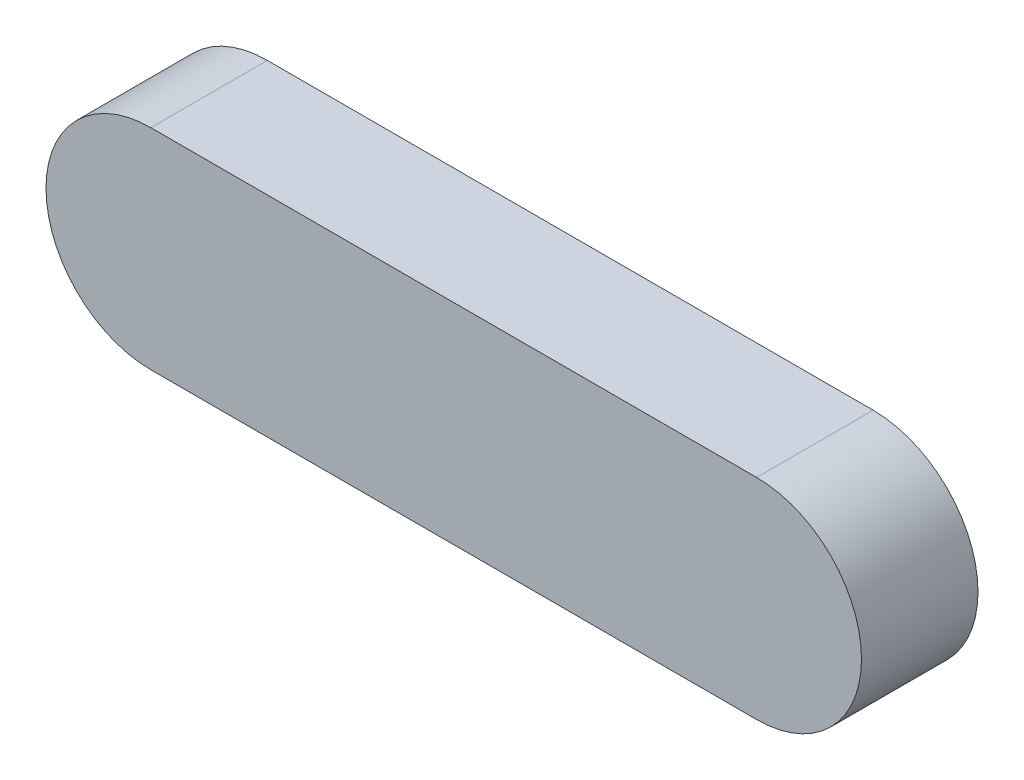
ISO-10303-21;
HEADER;
FILE_DESCRIPTION(('STEP AP214'),'2;1');
FILE_NAME('part.step','',(''),(''),'','','');
FILE_SCHEMA(('AUTOMOTIVE_DESIGN { 1 0 10303 214 1 1 1 1 }'));
ENDSEC;
DATA;
#1=APPLICATION_CONTEXT('core data for automotive mechanical design processes');
#2=APPLICATION_PROTOCOL_DEFINITION('international standard','automotive_design',2000,#1);
#3=PRODUCT_CONTEXT('',#1,'mechanical');
#4=PRODUCT('Part','Part','',(#3));
#5=PRODUCT_RELATED_PRODUCT_CATEGORY('part','',(#4));
#6=PRODUCT_DEFINITION_FORMATION('','',#4);
#7=PRODUCT_DEFINITION_CONTEXT('part definition',#1,'design');
#8=PRODUCT_DEFINITION('design','',#6,#7);
#9=PRODUCT_DEFINITION_SHAPE('','',#8);
#10=(LENGTH_UNIT() NAMED_UNIT(*) SI_UNIT(.MILLI.,.METRE.));
#11=(NAMED_UNIT(*) PLANE_ANGLE_UNIT() SI_UNIT($,.RADIAN.));
#12=(NAMED_UNIT(*) SI_UNIT($,.STERADIAN.) SOLID_ANGLE_UNIT());
#13=UNCERTAINTY_MEASURE_WITH_UNIT(LENGTH_MEASURE(1.E-05),#10,'distance_accuracy_value','');
#14=(GEOMETRIC_REPRESENTATION_CONTEXT(3) GLOBAL_UNCERTAINTY_ASSIGNED_CONTEXT((#13)) GLOBAL_UNIT_ASSIGNED_CONTEXT((#10,
#11,#12)) REPRESENTATION_CONTEXT('',''));
#15=CARTESIAN_POINT('',(0.,0.,0.));
#16=DIRECTION('',(0.,0.,1.));
#17=DIRECTION('',(1.,0.,0.));
#18=AXIS2_PLACEMENT_3D('',#15,#16,#17);
#19=CARTESIAN_POINT('',(-52.,0.,20.));
#20=DIRECTION('',(0.,0.,-1.));
#21=DIRECTION('',(-1.,0.,0.));
#22=AXIS2_PLACEMENT_3D('',#19,#20,#21);
#23=CYLINDRICAL_SURFACE('',#22,18.);
#24=CARTESIAN_POINT('',(-52.,0.,0.));
#25=DIRECTION('',(0.,0.,1.));
#26=DIRECTION('',(1.,0.,0.));
#27=AXIS2_PLACEMENT_3D('',#24,#25,#26);
#28=CIRCLE('',#27,18.);
#29=CARTESIAN_POINT('',(-52.,18.,0.));
#30=VERTEX_POINT('',#29);
#31=CARTESIAN_POINT('',(-52.,-18.,0.));
#32=VERTEX_POINT('',#31);
#33=EDGE_CURVE('E80',#30,#32,#28,.T.);
#34=ORIENTED_EDGE('',*,*,#33,.T.);
#35=DIRECTION('',(0.,0.,-1.));
#36=VECTOR('',#35,1.);
#37=CARTESIAN_POINT('',(-52.,-18.,20.));
#38=LINE('',#37,#36);
#39=CARTESIAN_POINT('',(-52.,-18.,20.));
#40=VERTEX_POINT('',#39);
#41=EDGE_CURVE('E11',#40,#32,#38,.T.);
#42=ORIENTED_EDGE('',*,*,#41,.F.);
#43=CARTESIAN_POINT('',(-52.,0.,20.));
#44=DIRECTION('',(0.,0.,1.));
#45=DIRECTION('',(1.,0.,0.));
#46=AXIS2_PLACEMENT_3D('',#43,#44,#45);
#47=CIRCLE('',#46,18.);
#48=CARTESIAN_POINT('',(-52.,18.,20.));
#49=VERTEX_POINT('',#48);
#50=EDGE_CURVE('E98',#49,#40,#47,.T.);
#51=ORIENTED_EDGE('',*,*,#50,.F.);
#52=DIRECTION('',(0.,0.,-1.));
#53=VECTOR('',#52,1.);
#54=CARTESIAN_POINT('',(-52.,18.,20.));
#55=LINE('',#54,#53);
#56=EDGE_CURVE('E92',#49,#30,#55,.T.);
#57=ORIENTED_EDGE('',*,*,#56,.T.);
#58=EDGE_LOOP('',(#34,#42,#51,#57));
#59=FACE_BOUND('',#58,.T.);
#60=ADVANCED_FACE('F36',(#59),#23,.T.);
#61=CARTESIAN_POINT('',(-52.,-18.,20.));
#62=DIRECTION('',(0.,1.,0.));
#63=DIRECTION('',(-1.,0.,0.));
#64=AXIS2_PLACEMENT_3D('',#61,#62,#63);
#65=PLANE('',#64);
#66=DIRECTION('',(1.,0.,0.));
#67=VECTOR('',#66,1.);
#68=CARTESIAN_POINT('',(-52.,-18.,0.));
#69=LINE('',#68,#67);
#70=CARTESIAN_POINT('',(52.,-18.,0.));
#71=VERTEX_POINT('',#70);
#72=EDGE_CURVE('E76',#32,#71,#69,.T.);
#73=ORIENTED_EDGE('',*,*,#72,.T.);
#74=DIRECTION('',(0.,0.,-1.));
#75=VECTOR('',#74,1.);
#76=CARTESIAN_POINT('',(52.,-18.,20.));
#77=LINE('',#76,#75);
#78=CARTESIAN_POINT('',(52.,-18.,20.));
#79=VERTEX_POINT('',#78);
#80=EDGE_CURVE('E43',#79,#71,#77,.T.);
#81=ORIENTED_EDGE('',*,*,#80,.F.);
#82=DIRECTION('',(1.,0.,0.));
#83=VECTOR('',#82,1.);
#84=CARTESIAN_POINT('',(-52.,-18.,20.));
#85=LINE('',#84,#83);
#86=EDGE_CURVE('E88',#40,#79,#85,.T.);
#87=ORIENTED_EDGE('',*,*,#86,.F.);
#88=ORIENTED_EDGE('',*,*,#41,.T.);
#89=EDGE_LOOP('',(#73,#81,#87,#88));
#90=FACE_BOUND('',#89,.T.);
#91=ADVANCED_FACE('F87',(#90),#65,.F.);
#92=CARTESIAN_POINT('',(52.,0.,20.));
#93=DIRECTION('',(0.,0.,-1.));
#94=DIRECTION('',(-1.,0.,0.));
#95=AXIS2_PLACEMENT_3D('',#92,#93,#94);
#96=CYLINDRICAL_SURFACE('',#95,18.);
#97=CARTESIAN_POINT('',(52.,0.,0.));
#98=DIRECTION('',(0.,0.,1.));
#99=DIRECTION('',(-1.,0.,0.));
#100=AXIS2_PLACEMENT_3D('',#97,#98,#99);
#101=CIRCLE('',#100,18.);
#102=CARTESIAN_POINT('',(52.,18.,0.));
#103=VERTEX_POINT('',#102);
#104=EDGE_CURVE('E81',#71,#103,#101,.T.);
#105=ORIENTED_EDGE('',*,*,#104,.T.);
#106=DIRECTION('',(0.,0.,-1.));
#107=VECTOR('',#106,1.);
#108=CARTESIAN_POINT('',(52.,18.,20.));
#109=LINE('',#108,#107);
#110=CARTESIAN_POINT('',(52.,18.,20.));
#111=VERTEX_POINT('',#110);
#112=EDGE_CURVE('E104',#111,#103,#109,.T.);
#113=ORIENTED_EDGE('',*,*,#112,.F.);
#114=CARTESIAN_POINT('',(52.,0.,20.));
#115=DIRECTION('',(0.,0.,1.));
#116=DIRECTION('',(-1.,0.,0.));
#117=AXIS2_PLACEMENT_3D('',#114,#115,#116);
#118=CIRCLE('',#117,18.);
#119=EDGE_CURVE('E55',#79,#111,#118,.T.);
#120=ORIENTED_EDGE('',*,*,#119,.F.);
#121=ORIENTED_EDGE('',*,*,#80,.T.);
#122=EDGE_LOOP('',(#105,#113,#120,#121));
#123=FACE_BOUND('',#122,.T.);
#124=ADVANCED_FACE('F107',(#123),#96,.T.);
#125=CARTESIAN_POINT('',(-52.,18.,20.));
#126=DIRECTION('',(0.,-1.,0.));
#127=DIRECTION('',(1.,0.,0.));
#128=AXIS2_PLACEMENT_3D('',#125,#126,#127);
#129=PLANE('',#128);
#130=DIRECTION('',(-1.,0.,0.));
#131=VECTOR('',#130,1.);
#132=CARTESIAN_POINT('',(-52.,18.,0.));
#133=LINE('',#132,#131);
#134=EDGE_CURVE('E96',#103,#30,#133,.T.);
#135=ORIENTED_EDGE('',*,*,#134,.T.);
#136=ORIENTED_EDGE('',*,*,#56,.F.);
#137=DIRECTION('',(-1.,0.,0.));
#138=VECTOR('',#137,1.);
#139=CARTESIAN_POINT('',(-52.,18.,20.));
#140=LINE('',#139,#138);
#141=EDGE_CURVE('E50',#111,#49,#140,.T.);
#142=ORIENTED_EDGE('',*,*,#141,.F.);
#143=ORIENTED_EDGE('',*,*,#112,.T.);
#144=EDGE_LOOP('',(#135,#136,#142,#143));
#145=FACE_BOUND('',#144,.T.);
#146=ADVANCED_FACE('F109',(#145),#129,.F.);
#147=CARTESIAN_POINT('',(-52.,0.,20.));
#148=DIRECTION('',(0.,0.,1.));
#149=DIRECTION('',(1.,0.,0.));
#150=AXIS2_PLACEMENT_3D('',#147,#148,#149);
#151=PLANE('',#150);
#152=ORIENTED_EDGE('',*,*,#50,.T.);
#153=ORIENTED_EDGE('',*,*,#86,.T.);
#154=ORIENTED_EDGE('',*,*,#119,.T.);
#155=ORIENTED_EDGE('',*,*,#141,.T.);
#156=EDGE_LOOP('',(#152,#153,#154,#155));
#157=FACE_BOUND('',#156,.T.);
#158=ADVANCED_FACE('F110',(#157),#151,.T.);
#159=CARTESIAN_POINT('',(-52.,0.,0.));
#160=DIRECTION('',(0.,0.,1.));
#161=DIRECTION('',(1.,0.,0.));
#162=AXIS2_PLACEMENT_3D('',#159,#160,#161);
#163=PLANE('',#162);
#164=ORIENTED_EDGE('',*,*,#33,.F.);
#165=ORIENTED_EDGE('',*,*,#134,.F.);
#166=ORIENTED_EDGE('',*,*,#104,.F.);
#167=ORIENTED_EDGE('',*,*,#72,.F.);
#168=EDGE_LOOP('',(#164,#165,#166,#167));
#169=FACE_BOUND('',#168,.T.);
#170=ADVANCED_FACE('F77',(#169),#163,.F.);
#171=CLOSED_SHELL('',(#60,#91,#124,#146,#158,#170));
#172=MANIFOLD_SOLID_BREP('B2',#171);
#173=ADVANCED_BREP_SHAPE_REPRESENTATION('',(#18,#172),#14);
#174=SHAPE_DEFINITION_REPRESENTATION(#9,#173);
ENDSEC;
END-ISO-10303-21;
